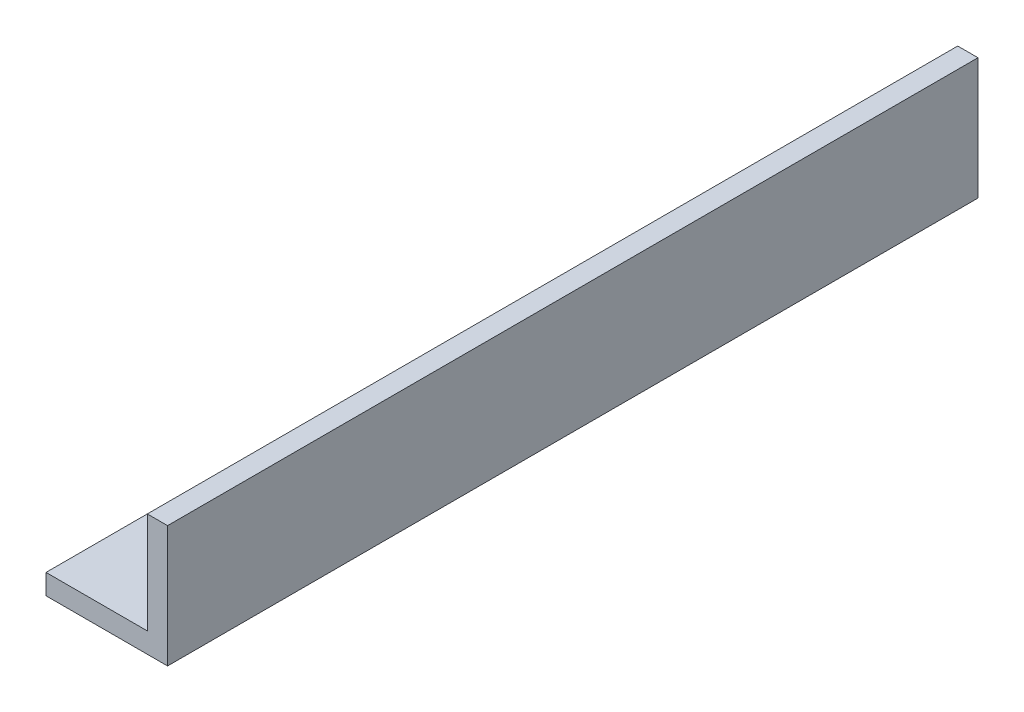
ISO-10303-21;
HEADER;
FILE_DESCRIPTION(('STEP AP214'),'2;1');
FILE_NAME('part.step','',(''),(''),'','','');
FILE_SCHEMA(('AUTOMOTIVE_DESIGN { 1 0 10303 214 1 1 1 1 }'));
ENDSEC;
DATA;
#1=APPLICATION_CONTEXT('core data for automotive mechanical design processes');
#2=APPLICATION_PROTOCOL_DEFINITION('international standard','automotive_design',2000,#1);
#3=PRODUCT_CONTEXT('',#1,'mechanical');
#4=PRODUCT('Part','Part','',(#3));
#5=PRODUCT_RELATED_PRODUCT_CATEGORY('part','',(#4));
#6=PRODUCT_DEFINITION_FORMATION('','',#4);
#7=PRODUCT_DEFINITION_CONTEXT('part definition',#1,'design');
#8=PRODUCT_DEFINITION('design','',#6,#7);
#9=PRODUCT_DEFINITION_SHAPE('','',#8);
#10=(LENGTH_UNIT() NAMED_UNIT(*) SI_UNIT(.MILLI.,.METRE.));
#11=(NAMED_UNIT(*) PLANE_ANGLE_UNIT() SI_UNIT($,.RADIAN.));
#12=(NAMED_UNIT(*) SI_UNIT($,.STERADIAN.) SOLID_ANGLE_UNIT());
#13=UNCERTAINTY_MEASURE_WITH_UNIT(LENGTH_MEASURE(1.E-05),#10,'distance_accuracy_value','');
#14=(GEOMETRIC_REPRESENTATION_CONTEXT(3) GLOBAL_UNCERTAINTY_ASSIGNED_CONTEXT((#13)) GLOBAL_UNIT_ASSIGNED_CONTEXT((#10,
#11,#12)) REPRESENTATION_CONTEXT('',''));
#15=CARTESIAN_POINT('',(0.,0.,0.));
#16=DIRECTION('',(0.,0.,1.));
#17=DIRECTION('',(1.,0.,0.));
#18=AXIS2_PLACEMENT_3D('',#15,#16,#17);
#19=CARTESIAN_POINT('',(19.05,0.,127.));
#20=DIRECTION('',(-1.,0.,0.));
#21=DIRECTION('',(0.,0.,1.));
#22=AXIS2_PLACEMENT_3D('',#19,#20,#21);
#23=PLANE('',#22);
#24=DIRECTION('',(0.,1.,0.));
#25=VECTOR('',#24,1.);
#26=CARTESIAN_POINT('',(19.05,0.,0.));
#27=LINE('',#26,#25);
#28=CARTESIAN_POINT('',(19.05,0.,0.));
#29=VERTEX_POINT('',#28);
#30=CARTESIAN_POINT('',(19.05,19.05,0.));
#31=VERTEX_POINT('',#30);
#32=EDGE_CURVE('E116',#29,#31,#27,.T.);
#33=ORIENTED_EDGE('',*,*,#32,.T.);
#34=DIRECTION('',(0.,0.,-1.));
#35=VECTOR('',#34,1.);
#36=CARTESIAN_POINT('',(19.05,19.05,127.));
#37=LINE('',#36,#35);
#38=CARTESIAN_POINT('',(19.05,19.05,127.));
#39=VERTEX_POINT('',#38);
#40=EDGE_CURVE('E11',#39,#31,#37,.T.);
#41=ORIENTED_EDGE('',*,*,#40,.F.);
#42=DIRECTION('',(0.,1.,0.));
#43=VECTOR('',#42,1.);
#44=CARTESIAN_POINT('',(19.05,0.,127.));
#45=LINE('',#44,#43);
#46=CARTESIAN_POINT('',(19.05,0.,127.));
#47=VERTEX_POINT('',#46);
#48=EDGE_CURVE('E81',#47,#39,#45,.T.);
#49=ORIENTED_EDGE('',*,*,#48,.F.);
#50=DIRECTION('',(0.,0.,-1.));
#51=VECTOR('',#50,1.);
#52=CARTESIAN_POINT('',(19.05,0.,127.));
#53=LINE('',#52,#51);
#54=EDGE_CURVE('E112',#47,#29,#53,.T.);
#55=ORIENTED_EDGE('',*,*,#54,.T.);
#56=EDGE_LOOP('',(#33,#41,#49,#55));
#57=FACE_BOUND('',#56,.T.);
#58=ADVANCED_FACE('F35',(#57),#23,.F.);
#59=CARTESIAN_POINT('',(15.875,19.05,127.));
#60=DIRECTION('',(0.,1.,0.));
#61=DIRECTION('',(0.,0.,1.));
#62=AXIS2_PLACEMENT_3D('',#59,#60,#61);
#63=PLANE('',#62);
#64=DIRECTION('',(1.,0.,0.));
#65=VECTOR('',#64,1.);
#66=CARTESIAN_POINT('',(15.875,19.05,0.));
#67=LINE('',#66,#65);
#68=CARTESIAN_POINT('',(15.875,19.05,0.));
#69=VERTEX_POINT('',#68);
#70=EDGE_CURVE('E119',#69,#31,#67,.T.);
#71=ORIENTED_EDGE('',*,*,#70,.F.);
#72=DIRECTION('',(0.,0.,-1.));
#73=VECTOR('',#72,1.);
#74=CARTESIAN_POINT('',(15.875,19.05,127.));
#75=LINE('',#74,#73);
#76=CARTESIAN_POINT('',(15.875,19.05,127.));
#77=VERTEX_POINT('',#76);
#78=EDGE_CURVE('E43',#77,#69,#75,.T.);
#79=ORIENTED_EDGE('',*,*,#78,.F.);
#80=DIRECTION('',(1.,0.,0.));
#81=VECTOR('',#80,1.);
#82=CARTESIAN_POINT('',(15.875,19.05,127.));
#83=LINE('',#82,#81);
#84=EDGE_CURVE('E205',#77,#39,#83,.T.);
#85=ORIENTED_EDGE('',*,*,#84,.T.);
#86=ORIENTED_EDGE('',*,*,#40,.T.);
#87=EDGE_LOOP('',(#71,#79,#85,#86));
#88=FACE_BOUND('',#87,.T.);
#89=ADVANCED_FACE('F137',(#88),#63,.T.);
#90=CARTESIAN_POINT('',(15.875,0.,127.));
#91=DIRECTION('',(-1.,0.,0.));
#92=DIRECTION('',(0.,0.,1.));
#93=AXIS2_PLACEMENT_3D('',#90,#91,#92);
#94=PLANE('',#93);
#95=DIRECTION('',(0.,1.,0.));
#96=VECTOR('',#95,1.);
#97=CARTESIAN_POINT('',(15.875,0.,0.));
#98=LINE('',#97,#96);
#99=CARTESIAN_POINT('',(15.875,3.175,0.));
#100=VERTEX_POINT('',#99);
#101=EDGE_CURVE('E122',#100,#69,#98,.T.);
#102=ORIENTED_EDGE('',*,*,#101,.F.);
#103=DIRECTION('',(0.,0.,-1.));
#104=VECTOR('',#103,1.);
#105=CARTESIAN_POINT('',(15.875,3.175,127.));
#106=LINE('',#105,#104);
#107=CARTESIAN_POINT('',(15.875,3.175,127.));
#108=VERTEX_POINT('',#107);
#109=EDGE_CURVE('E102',#108,#100,#106,.T.);
#110=ORIENTED_EDGE('',*,*,#109,.F.);
#111=DIRECTION('',(0.,1.,0.));
#112=VECTOR('',#111,1.);
#113=CARTESIAN_POINT('',(15.875,0.,127.));
#114=LINE('',#113,#112);
#115=EDGE_CURVE('E108',#108,#77,#114,.T.);
#116=ORIENTED_EDGE('',*,*,#115,.T.);
#117=ORIENTED_EDGE('',*,*,#78,.T.);
#118=EDGE_LOOP('',(#102,#110,#116,#117));
#119=FACE_BOUND('',#118,.T.);
#120=ADVANCED_FACE('F134',(#119),#94,.T.);
#121=CARTESIAN_POINT('',(0.,3.175,127.));
#122=DIRECTION('',(0.,1.,0.));
#123=DIRECTION('',(0.,0.,1.));
#124=AXIS2_PLACEMENT_3D('',#121,#122,#123);
#125=PLANE('',#124);
#126=DIRECTION('',(1.,0.,0.));
#127=VECTOR('',#126,1.);
#128=CARTESIAN_POINT('',(0.,3.175,0.));
#129=LINE('',#128,#127);
#130=CARTESIAN_POINT('',(0.,3.175,0.));
#131=VERTEX_POINT('',#130);
#132=EDGE_CURVE('E97',#131,#100,#129,.T.);
#133=ORIENTED_EDGE('',*,*,#132,.F.);
#134=DIRECTION('',(0.,0.,-1.));
#135=VECTOR('',#134,1.);
#136=CARTESIAN_POINT('',(0.,3.175,127.));
#137=LINE('',#136,#135);
#138=CARTESIAN_POINT('',(0.,3.175,127.));
#139=VERTEX_POINT('',#138);
#140=EDGE_CURVE('E92',#139,#131,#137,.T.);
#141=ORIENTED_EDGE('',*,*,#140,.F.);
#142=DIRECTION('',(1.,0.,0.));
#143=VECTOR('',#142,1.);
#144=CARTESIAN_POINT('',(0.,3.175,127.));
#145=LINE('',#144,#143);
#146=EDGE_CURVE('E95',#139,#108,#145,.T.);
#147=ORIENTED_EDGE('',*,*,#146,.T.);
#148=ORIENTED_EDGE('',*,*,#109,.T.);
#149=EDGE_LOOP('',(#133,#141,#147,#148));
#150=FACE_BOUND('',#149,.T.);
#151=ADVANCED_FACE('F94',(#150),#125,.T.);
#152=CARTESIAN_POINT('',(0.,0.,127.));
#153=DIRECTION('',(-1.,0.,0.));
#154=DIRECTION('',(0.,0.,1.));
#155=AXIS2_PLACEMENT_3D('',#152,#153,#154);
#156=PLANE('',#155);
#157=DIRECTION('',(0.,1.,0.));
#158=VECTOR('',#157,1.);
#159=CARTESIAN_POINT('',(0.,0.,0.));
#160=LINE('',#159,#158);
#161=CARTESIAN_POINT('',(0.,0.,0.));
#162=VERTEX_POINT('',#161);
#163=EDGE_CURVE('E126',#162,#131,#160,.T.);
#164=ORIENTED_EDGE('',*,*,#163,.F.);
#165=DIRECTION('',(0.,0.,-1.));
#166=VECTOR('',#165,1.);
#167=CARTESIAN_POINT('',(0.,0.,127.));
#168=LINE('',#167,#166);
#169=CARTESIAN_POINT('',(0.,0.,127.));
#170=VERTEX_POINT('',#169);
#171=EDGE_CURVE('E72',#170,#162,#168,.T.);
#172=ORIENTED_EDGE('',*,*,#171,.F.);
#173=DIRECTION('',(0.,1.,0.));
#174=VECTOR('',#173,1.);
#175=CARTESIAN_POINT('',(0.,0.,127.));
#176=LINE('',#175,#174);
#177=EDGE_CURVE('E106',#170,#139,#176,.T.);
#178=ORIENTED_EDGE('',*,*,#177,.T.);
#179=ORIENTED_EDGE('',*,*,#140,.T.);
#180=EDGE_LOOP('',(#164,#172,#178,#179));
#181=FACE_BOUND('',#180,.T.);
#182=ADVANCED_FACE('F110',(#181),#156,.T.);
#183=CARTESIAN_POINT('',(0.,0.,127.));
#184=DIRECTION('',(0.,1.,0.));
#185=DIRECTION('',(0.,0.,1.));
#186=AXIS2_PLACEMENT_3D('',#183,#184,#185);
#187=PLANE('',#186);
#188=DIRECTION('',(1.,0.,0.));
#189=VECTOR('',#188,1.);
#190=CARTESIAN_POINT('',(0.,0.,0.));
#191=LINE('',#190,#189);
#192=EDGE_CURVE('E75',#162,#29,#191,.T.);
#193=ORIENTED_EDGE('',*,*,#192,.T.);
#194=ORIENTED_EDGE('',*,*,#54,.F.);
#195=DIRECTION('',(1.,0.,0.));
#196=VECTOR('',#195,1.);
#197=CARTESIAN_POINT('',(0.,0.,127.));
#198=LINE('',#197,#196);
#199=EDGE_CURVE('E51',#170,#47,#198,.T.);
#200=ORIENTED_EDGE('',*,*,#199,.F.);
#201=ORIENTED_EDGE('',*,*,#171,.T.);
#202=EDGE_LOOP('',(#193,#194,#200,#201));
#203=FACE_BOUND('',#202,.T.);
#204=ADVANCED_FACE('F142',(#203),#187,.F.);
#205=CARTESIAN_POINT('',(0.,0.,127.));
#206=DIRECTION('',(0.,0.,-1.));
#207=DIRECTION('',(-1.,0.,0.));
#208=AXIS2_PLACEMENT_3D('',#205,#206,#207);
#209=PLANE('',#208);
#210=ORIENTED_EDGE('',*,*,#48,.T.);
#211=ORIENTED_EDGE('',*,*,#84,.F.);
#212=ORIENTED_EDGE('',*,*,#115,.F.);
#213=ORIENTED_EDGE('',*,*,#146,.F.);
#214=ORIENTED_EDGE('',*,*,#177,.F.);
#215=ORIENTED_EDGE('',*,*,#199,.T.);
#216=EDGE_LOOP('',(#210,#211,#212,#213,#214,#215));
#217=FACE_BOUND('',#216,.T.);
#218=ADVANCED_FACE('F105',(#217),#209,.F.);
#219=CARTESIAN_POINT('',(0.,0.,0.));
#220=DIRECTION('',(0.,0.,-1.));
#221=DIRECTION('',(-1.,0.,0.));
#222=AXIS2_PLACEMENT_3D('',#219,#220,#221);
#223=PLANE('',#222);
#224=ORIENTED_EDGE('',*,*,#32,.F.);
#225=ORIENTED_EDGE('',*,*,#192,.F.);
#226=ORIENTED_EDGE('',*,*,#163,.T.);
#227=ORIENTED_EDGE('',*,*,#132,.T.);
#228=ORIENTED_EDGE('',*,*,#101,.T.);
#229=ORIENTED_EDGE('',*,*,#70,.T.);
#230=EDGE_LOOP('',(#224,#225,#226,#227,#228,#229));
#231=FACE_BOUND('',#230,.T.);
#232=ADVANCED_FACE('F140',(#231),#223,.T.);
#233=CLOSED_SHELL('',(#58,#89,#120,#151,#182,#204,#218,#232));
#234=MANIFOLD_SOLID_BREP('B2',#233);
#235=ADVANCED_BREP_SHAPE_REPRESENTATION('',(#18,#234),#14);
#236=SHAPE_DEFINITION_REPRESENTATION(#9,#235);
ENDSEC;
END-ISO-10303-21;
